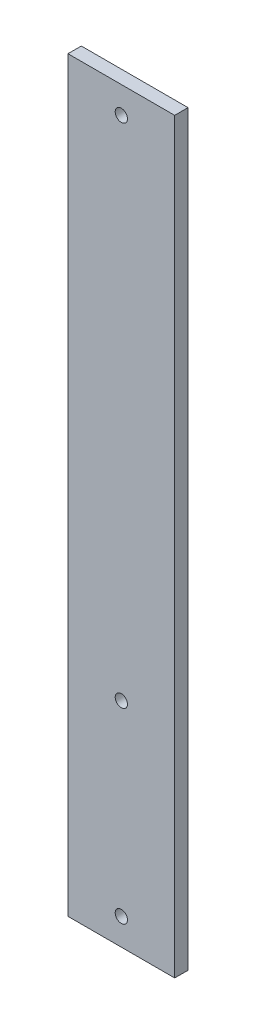
ISO-10303-21;
HEADER;
FILE_DESCRIPTION(('STEP AP214'),'2;1');
FILE_NAME('part.step','',(''),(''),'','','');
FILE_SCHEMA(('AUTOMOTIVE_DESIGN { 1 0 10303 214 1 1 1 1 }'));
ENDSEC;
DATA;
#1=APPLICATION_CONTEXT('core data for automotive mechanical design processes');
#2=APPLICATION_PROTOCOL_DEFINITION('international standard','automotive_design',2000,#1);
#3=PRODUCT_CONTEXT('',#1,'mechanical');
#4=PRODUCT('Part','Part','',(#3));
#5=PRODUCT_RELATED_PRODUCT_CATEGORY('part','',(#4));
#6=PRODUCT_DEFINITION_FORMATION('','',#4);
#7=PRODUCT_DEFINITION_CONTEXT('part definition',#1,'design');
#8=PRODUCT_DEFINITION('design','',#6,#7);
#9=PRODUCT_DEFINITION_SHAPE('','',#8);
#10=(LENGTH_UNIT() NAMED_UNIT(*) SI_UNIT(.MILLI.,.METRE.));
#11=(NAMED_UNIT(*) PLANE_ANGLE_UNIT() SI_UNIT($,.RADIAN.));
#12=(NAMED_UNIT(*) SI_UNIT($,.STERADIAN.) SOLID_ANGLE_UNIT());
#13=UNCERTAINTY_MEASURE_WITH_UNIT(LENGTH_MEASURE(1.E-05),#10,'distance_accuracy_value','');
#14=(GEOMETRIC_REPRESENTATION_CONTEXT(3) GLOBAL_UNCERTAINTY_ASSIGNED_CONTEXT((#13)) GLOBAL_UNIT_ASSIGNED_CONTEXT((#10,
#11,#12)) REPRESENTATION_CONTEXT('',''));
#15=CARTESIAN_POINT('',(0.,0.,0.));
#16=DIRECTION('',(0.,0.,1.));
#17=DIRECTION('',(1.,0.,0.));
#18=AXIS2_PLACEMENT_3D('',#15,#16,#17);
#19=CARTESIAN_POINT('',(0.,0.,3.175));
#20=DIRECTION('',(0.,0.,-1.));
#21=DIRECTION('',(-1.,0.,0.));
#22=AXIS2_PLACEMENT_3D('',#19,#20,#21);
#23=PLANE('',#22);
#24=DIRECTION('',(0.,-1.,0.));
#25=VECTOR('',#24,1.);
#26=CARTESIAN_POINT('',(0.,0.,3.175));
#27=LINE('',#26,#25);
#28=CARTESIAN_POINT('',(0.,177.8,3.175));
#29=VERTEX_POINT('',#28);
#30=CARTESIAN_POINT('',(0.,0.,3.175));
#31=VERTEX_POINT('',#30);
#32=EDGE_CURVE('E98',#29,#31,#27,.T.);
#33=ORIENTED_EDGE('',*,*,#32,.T.);
#34=DIRECTION('',(1.,0.,0.));
#35=VECTOR('',#34,1.);
#36=CARTESIAN_POINT('',(0.,0.,3.175));
#37=LINE('',#36,#35);
#38=CARTESIAN_POINT('',(25.4,0.,3.175));
#39=VERTEX_POINT('',#38);
#40=EDGE_CURVE('E93',#31,#39,#37,.T.);
#41=ORIENTED_EDGE('',*,*,#40,.T.);
#42=DIRECTION('',(0.,1.,0.));
#43=VECTOR('',#42,1.);
#44=CARTESIAN_POINT('',(25.4,0.,3.175));
#45=LINE('',#44,#43);
#46=CARTESIAN_POINT('',(25.4,177.8,3.175));
#47=VERTEX_POINT('',#46);
#48=EDGE_CURVE('E96',#39,#47,#45,.T.);
#49=ORIENTED_EDGE('',*,*,#48,.T.);
#50=DIRECTION('',(-1.,0.,0.));
#51=VECTOR('',#50,1.);
#52=CARTESIAN_POINT('',(0.,177.8,3.175));
#53=LINE('',#52,#51);
#54=EDGE_CURVE('E63',#47,#29,#53,.T.);
#55=ORIENTED_EDGE('',*,*,#54,.T.);
#56=EDGE_LOOP('',(#33,#41,#49,#55));
#57=FACE_BOUND('',#56,.T.);
#58=CARTESIAN_POINT('',(12.7,171.45,3.175));
#59=DIRECTION('',(0.,0.,1.));
#60=DIRECTION('',(1.,0.,0.));
#61=AXIS2_PLACEMENT_3D('',#58,#59,#60);
#62=CIRCLE('',#61,1.4605);
#63=CARTESIAN_POINT('',(14.1605,171.45,3.175));
#64=VERTEX_POINT('',#63);
#65=EDGE_CURVE('E118',#64,#64,#62,.T.);
#66=ORIENTED_EDGE('',*,*,#65,.F.);
#67=EDGE_LOOP('',(#66));
#68=FACE_BOUND('',#67,.T.);
#69=CARTESIAN_POINT('',(12.7,50.8,3.175));
#70=DIRECTION('',(0.,0.,1.));
#71=DIRECTION('',(1.,0.,0.));
#72=AXIS2_PLACEMENT_3D('',#69,#70,#71);
#73=CIRCLE('',#72,1.4605);
#74=CARTESIAN_POINT('',(14.1605,50.8,3.175));
#75=VERTEX_POINT('',#74);
#76=EDGE_CURVE('E140',#75,#75,#73,.T.);
#77=ORIENTED_EDGE('',*,*,#76,.F.);
#78=EDGE_LOOP('',(#77));
#79=FACE_BOUND('',#78,.T.);
#80=CARTESIAN_POINT('',(12.7,6.35,3.175));
#81=DIRECTION('',(0.,0.,1.));
#82=DIRECTION('',(1.,0.,0.));
#83=AXIS2_PLACEMENT_3D('',#80,#81,#82);
#84=CIRCLE('',#83,1.4605);
#85=CARTESIAN_POINT('',(14.1605,6.35,3.175));
#86=VERTEX_POINT('',#85);
#87=EDGE_CURVE('E148',#86,#86,#84,.T.);
#88=ORIENTED_EDGE('',*,*,#87,.F.);
#89=EDGE_LOOP('',(#88));
#90=FACE_BOUND('',#89,.T.);
#91=ADVANCED_FACE('F45',(#57,#68,#79,#90),#23,.F.);
#92=CARTESIAN_POINT('',(0.,0.,0.));
#93=DIRECTION('',(0.,0.,-1.));
#94=DIRECTION('',(-1.,0.,0.));
#95=AXIS2_PLACEMENT_3D('',#92,#93,#94);
#96=PLANE('',#95);
#97=CARTESIAN_POINT('',(12.7,50.8,0.));
#98=DIRECTION('',(0.,0.,1.));
#99=DIRECTION('',(1.,0.,0.));
#100=AXIS2_PLACEMENT_3D('',#97,#98,#99);
#101=CIRCLE('',#100,1.4605);
#102=CARTESIAN_POINT('',(14.1605,50.8,0.));
#103=VERTEX_POINT('',#102);
#104=EDGE_CURVE('E144',#103,#103,#101,.T.);
#105=ORIENTED_EDGE('',*,*,#104,.T.);
#106=EDGE_LOOP('',(#105));
#107=FACE_BOUND('',#106,.T.);
#108=DIRECTION('',(0.,-1.,0.));
#109=VECTOR('',#108,1.);
#110=CARTESIAN_POINT('',(0.,0.,0.));
#111=LINE('',#110,#109);
#112=CARTESIAN_POINT('',(0.,177.8,0.));
#113=VERTEX_POINT('',#112);
#114=CARTESIAN_POINT('',(0.,0.,0.));
#115=VERTEX_POINT('',#114);
#116=EDGE_CURVE('E114',#113,#115,#111,.T.);
#117=ORIENTED_EDGE('',*,*,#116,.F.);
#118=DIRECTION('',(-1.,0.,0.));
#119=VECTOR('',#118,1.);
#120=CARTESIAN_POINT('',(0.,177.8,0.));
#121=LINE('',#120,#119);
#122=CARTESIAN_POINT('',(25.4,177.8,0.));
#123=VERTEX_POINT('',#122);
#124=EDGE_CURVE('E86',#123,#113,#121,.T.);
#125=ORIENTED_EDGE('',*,*,#124,.F.);
#126=DIRECTION('',(0.,1.,0.));
#127=VECTOR('',#126,1.);
#128=CARTESIAN_POINT('',(25.4,0.,0.));
#129=LINE('',#128,#127);
#130=CARTESIAN_POINT('',(25.4,0.,0.));
#131=VERTEX_POINT('',#130);
#132=EDGE_CURVE('E80',#131,#123,#129,.T.);
#133=ORIENTED_EDGE('',*,*,#132,.F.);
#134=DIRECTION('',(1.,0.,0.));
#135=VECTOR('',#134,1.);
#136=CARTESIAN_POINT('',(0.,0.,0.));
#137=LINE('',#136,#135);
#138=EDGE_CURVE('E103',#115,#131,#137,.T.);
#139=ORIENTED_EDGE('',*,*,#138,.F.);
#140=EDGE_LOOP('',(#117,#125,#133,#139));
#141=FACE_BOUND('',#140,.T.);
#142=CARTESIAN_POINT('',(12.7,171.45,0.));
#143=DIRECTION('',(0.,0.,1.));
#144=DIRECTION('',(1.,0.,0.));
#145=AXIS2_PLACEMENT_3D('',#142,#143,#144);
#146=CIRCLE('',#145,1.4605);
#147=CARTESIAN_POINT('',(14.1605,171.45,0.));
#148=VERTEX_POINT('',#147);
#149=EDGE_CURVE('E136',#148,#148,#146,.T.);
#150=ORIENTED_EDGE('',*,*,#149,.T.);
#151=EDGE_LOOP('',(#150));
#152=FACE_BOUND('',#151,.T.);
#153=CARTESIAN_POINT('',(12.7,6.35,0.));
#154=DIRECTION('',(0.,0.,1.));
#155=DIRECTION('',(1.,0.,0.));
#156=AXIS2_PLACEMENT_3D('',#153,#154,#155);
#157=CIRCLE('',#156,1.4605);
#158=CARTESIAN_POINT('',(14.1605,6.35,0.));
#159=VERTEX_POINT('',#158);
#160=EDGE_CURVE('E152',#159,#159,#157,.T.);
#161=ORIENTED_EDGE('',*,*,#160,.T.);
#162=EDGE_LOOP('',(#161));
#163=FACE_BOUND('',#162,.T.);
#164=ADVANCED_FACE('F131',(#107,#141,#152,#163),#96,.T.);
#165=CARTESIAN_POINT('',(0.,0.,3.175));
#166=DIRECTION('',(1.,0.,0.));
#167=DIRECTION('',(0.,0.,-1.));
#168=AXIS2_PLACEMENT_3D('',#165,#166,#167);
#169=PLANE('',#168);
#170=ORIENTED_EDGE('',*,*,#116,.T.);
#171=DIRECTION('',(0.,0.,-1.));
#172=VECTOR('',#171,1.);
#173=CARTESIAN_POINT('',(0.,0.,3.175));
#174=LINE('',#173,#172);
#175=EDGE_CURVE('E11',#31,#115,#174,.T.);
#176=ORIENTED_EDGE('',*,*,#175,.F.);
#177=ORIENTED_EDGE('',*,*,#32,.F.);
#178=DIRECTION('',(0.,0.,-1.));
#179=VECTOR('',#178,1.);
#180=CARTESIAN_POINT('',(0.,177.8,3.175));
#181=LINE('',#180,#179);
#182=EDGE_CURVE('E110',#29,#113,#181,.T.);
#183=ORIENTED_EDGE('',*,*,#182,.T.);
#184=EDGE_LOOP('',(#170,#176,#177,#183));
#185=FACE_BOUND('',#184,.T.);
#186=ADVANCED_FACE('F47',(#185),#169,.F.);
#187=CARTESIAN_POINT('',(0.,0.,3.175));
#188=DIRECTION('',(0.,1.,0.));
#189=DIRECTION('',(0.,0.,1.));
#190=AXIS2_PLACEMENT_3D('',#187,#188,#189);
#191=PLANE('',#190);
#192=ORIENTED_EDGE('',*,*,#138,.T.);
#193=DIRECTION('',(0.,0.,-1.));
#194=VECTOR('',#193,1.);
#195=CARTESIAN_POINT('',(25.4,0.,3.175));
#196=LINE('',#195,#194);
#197=EDGE_CURVE('E55',#39,#131,#196,.T.);
#198=ORIENTED_EDGE('',*,*,#197,.F.);
#199=ORIENTED_EDGE('',*,*,#40,.F.);
#200=ORIENTED_EDGE('',*,*,#175,.T.);
#201=EDGE_LOOP('',(#192,#198,#199,#200));
#202=FACE_BOUND('',#201,.T.);
#203=ADVANCED_FACE('F102',(#202),#191,.F.);
#204=CARTESIAN_POINT('',(25.4,0.,3.175));
#205=DIRECTION('',(-1.,0.,0.));
#206=DIRECTION('',(0.,0.,1.));
#207=AXIS2_PLACEMENT_3D('',#204,#205,#206);
#208=PLANE('',#207);
#209=ORIENTED_EDGE('',*,*,#132,.T.);
#210=DIRECTION('',(0.,0.,-1.));
#211=VECTOR('',#210,1.);
#212=CARTESIAN_POINT('',(25.4,177.8,3.175));
#213=LINE('',#212,#211);
#214=EDGE_CURVE('E105',#47,#123,#213,.T.);
#215=ORIENTED_EDGE('',*,*,#214,.F.);
#216=ORIENTED_EDGE('',*,*,#48,.F.);
#217=ORIENTED_EDGE('',*,*,#197,.T.);
#218=EDGE_LOOP('',(#209,#215,#216,#217));
#219=FACE_BOUND('',#218,.T.);
#220=ADVANCED_FACE('F106',(#219),#208,.F.);
#221=CARTESIAN_POINT('',(0.,177.8,3.175));
#222=DIRECTION('',(0.,-1.,0.));
#223=DIRECTION('',(0.,0.,-1.));
#224=AXIS2_PLACEMENT_3D('',#221,#222,#223);
#225=PLANE('',#224);
#226=ORIENTED_EDGE('',*,*,#124,.T.);
#227=ORIENTED_EDGE('',*,*,#182,.F.);
#228=ORIENTED_EDGE('',*,*,#54,.F.);
#229=ORIENTED_EDGE('',*,*,#214,.T.);
#230=EDGE_LOOP('',(#226,#227,#228,#229));
#231=FACE_BOUND('',#230,.T.);
#232=ADVANCED_FACE('F128',(#231),#225,.F.);
#233=CARTESIAN_POINT('',(12.7,171.45,3.175));
#234=DIRECTION('',(0.,0.,-1.));
#235=DIRECTION('',(-1.,0.,0.));
#236=AXIS2_PLACEMENT_3D('',#233,#234,#235);
#237=CYLINDRICAL_SURFACE('',#236,1.4605);
#238=ORIENTED_EDGE('',*,*,#65,.T.);
#239=EDGE_LOOP('',(#238));
#240=FACE_BOUND('',#239,.T.);
#241=ORIENTED_EDGE('',*,*,#149,.F.);
#242=EDGE_LOOP('',(#241));
#243=FACE_BOUND('',#242,.T.);
#244=ADVANCED_FACE('F171',(#240,#243),#237,.F.);
#245=CARTESIAN_POINT('',(12.7,50.8,3.175));
#246=DIRECTION('',(0.,0.,-1.));
#247=DIRECTION('',(-1.,0.,0.));
#248=AXIS2_PLACEMENT_3D('',#245,#246,#247);
#249=CYLINDRICAL_SURFACE('',#248,1.4605);
#250=ORIENTED_EDGE('',*,*,#76,.T.);
#251=EDGE_LOOP('',(#250));
#252=FACE_BOUND('',#251,.T.);
#253=ORIENTED_EDGE('',*,*,#104,.F.);
#254=EDGE_LOOP('',(#253));
#255=FACE_BOUND('',#254,.T.);
#256=ADVANCED_FACE('F216',(#252,#255),#249,.F.);
#257=CARTESIAN_POINT('',(12.7,6.35,3.175));
#258=DIRECTION('',(0.,0.,-1.));
#259=DIRECTION('',(-1.,0.,0.));
#260=AXIS2_PLACEMENT_3D('',#257,#258,#259);
#261=CYLINDRICAL_SURFACE('',#260,1.4605);
#262=ORIENTED_EDGE('',*,*,#87,.T.);
#263=EDGE_LOOP('',(#262));
#264=FACE_BOUND('',#263,.T.);
#265=ORIENTED_EDGE('',*,*,#160,.F.);
#266=EDGE_LOOP('',(#265));
#267=FACE_BOUND('',#266,.T.);
#268=ADVANCED_FACE('F160',(#264,#267),#261,.F.);
#269=CLOSED_SHELL('',(#91,#164,#186,#203,#220,#232,#244,#256,#268));
#270=MANIFOLD_SOLID_BREP('B2',#269);
#271=ADVANCED_BREP_SHAPE_REPRESENTATION('',(#18,#270),#14);
#272=SHAPE_DEFINITION_REPRESENTATION(#9,#271);
ENDSEC;
END-ISO-10303-21;
